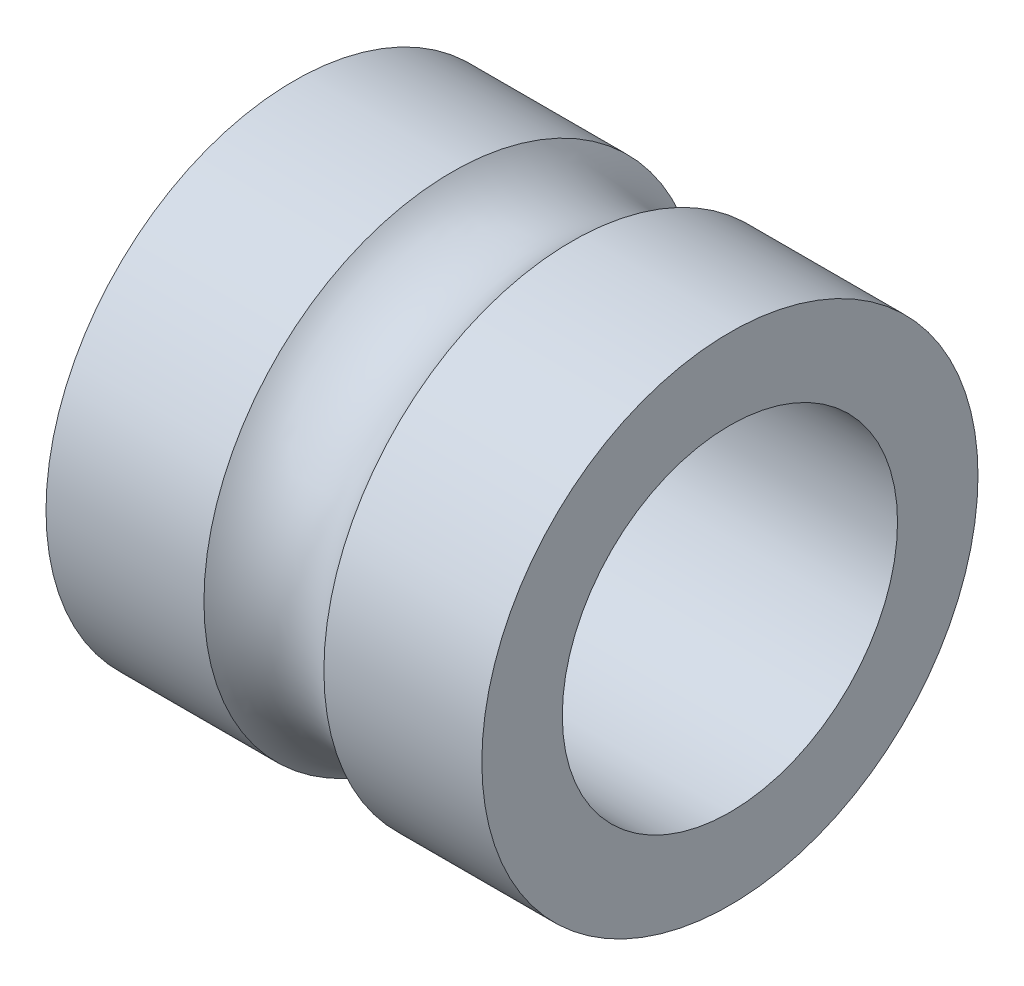
ISO-10303-21;
HEADER;
FILE_DESCRIPTION(('STEP AP214'),'2;1');
FILE_NAME('part.step','',(''),(''),'','','');
FILE_SCHEMA(('AUTOMOTIVE_DESIGN { 1 0 10303 214 1 1 1 1 }'));
ENDSEC;
DATA;
#1=APPLICATION_CONTEXT('core data for automotive mechanical design processes');
#2=APPLICATION_PROTOCOL_DEFINITION('international standard','automotive_design',2000,#1);
#3=PRODUCT_CONTEXT('',#1,'mechanical');
#4=PRODUCT('Part','Part','',(#3));
#5=PRODUCT_RELATED_PRODUCT_CATEGORY('part','',(#4));
#6=PRODUCT_DEFINITION_FORMATION('','',#4);
#7=PRODUCT_DEFINITION_CONTEXT('part definition',#1,'design');
#8=PRODUCT_DEFINITION('design','',#6,#7);
#9=PRODUCT_DEFINITION_SHAPE('','',#8);
#10=(LENGTH_UNIT() NAMED_UNIT(*) SI_UNIT(.MILLI.,.METRE.));
#11=(NAMED_UNIT(*) PLANE_ANGLE_UNIT() SI_UNIT($,.RADIAN.));
#12=(NAMED_UNIT(*) SI_UNIT($,.STERADIAN.) SOLID_ANGLE_UNIT());
#13=UNCERTAINTY_MEASURE_WITH_UNIT(LENGTH_MEASURE(1.E-05),#10,'distance_accuracy_value','');
#14=(GEOMETRIC_REPRESENTATION_CONTEXT(3) GLOBAL_UNCERTAINTY_ASSIGNED_CONTEXT((#13)) GLOBAL_UNIT_ASSIGNED_CONTEXT((#10,
#11,#12)) REPRESENTATION_CONTEXT('',''));
#15=CARTESIAN_POINT('',(0.,0.,0.));
#16=DIRECTION('',(0.,0.,1.));
#17=DIRECTION('',(1.,0.,0.));
#18=AXIS2_PLACEMENT_3D('',#15,#16,#17);
#19=CARTESIAN_POINT('',(10.,11.384615385,0.));
#20=DIRECTION('',(-1.,0.,0.));
#21=DIRECTION('',(0.,0.,1.));
#22=AXIS2_PLACEMENT_3D('',#19,#20,#21);
#23=PLANE('',#22);
#24=CARTESIAN_POINT('',(10.,0.,0.));
#25=DIRECTION('',(-1.,0.,0.));
#26=DIRECTION('',(0.,0.,1.));
#27=AXIS2_PLACEMENT_3D('',#24,#25,#26);
#28=CIRCLE('',#27,11.384615385);
#29=CARTESIAN_POINT('',(10.,0.,11.384615385));
#30=VERTEX_POINT('',#29);
#31=EDGE_CURVE('E10',#30,#30,#28,.T.);
#32=ORIENTED_EDGE('',*,*,#31,.F.);
#33=EDGE_LOOP('',(#32));
#34=FACE_BOUND('',#33,.T.);
#35=CARTESIAN_POINT('',(10.,0.,0.));
#36=DIRECTION('',(-1.,0.,0.));
#37=DIRECTION('',(0.,0.,1.));
#38=AXIS2_PLACEMENT_3D('',#35,#36,#37);
#39=CIRCLE('',#38,7.69230769);
#40=CARTESIAN_POINT('',(10.,0.,7.69230769));
#41=VERTEX_POINT('',#40);
#42=EDGE_CURVE('E61',#41,#41,#39,.T.);
#43=ORIENTED_EDGE('',*,*,#42,.T.);
#44=EDGE_LOOP('',(#43));
#45=FACE_BOUND('',#44,.T.);
#46=ADVANCED_FACE('F39',(#34,#45),#23,.F.);
#47=CARTESIAN_POINT('',(0.,0.,0.));
#48=DIRECTION('',(-1.,0.,0.));
#49=DIRECTION('',(0.,0.,1.));
#50=AXIS2_PLACEMENT_3D('',#47,#48,#49);
#51=CYLINDRICAL_SURFACE('',#50,11.384615385);
#52=CARTESIAN_POINT('',(2.75208366624918,0.,0.));
#53=DIRECTION('',(-1.,0.,0.));
#54=DIRECTION('',(0.,0.,1.));
#55=AXIS2_PLACEMENT_3D('',#52,#53,#54);
#56=CIRCLE('',#55,11.384615385);
#57=CARTESIAN_POINT('',(2.75208366624918,0.,11.384615385));
#58=VERTEX_POINT('',#57);
#59=EDGE_CURVE('E45',#58,#58,#56,.T.);
#60=ORIENTED_EDGE('',*,*,#59,.F.);
#61=EDGE_LOOP('',(#60));
#62=FACE_BOUND('',#61,.T.);
#63=ORIENTED_EDGE('',*,*,#31,.T.);
#64=EDGE_LOOP('',(#63));
#65=FACE_BOUND('',#64,.T.);
#66=ADVANCED_FACE('F86',(#62,#65),#51,.T.);
#67=CARTESIAN_POINT('',(0.,0.,0.));
#68=DIRECTION('',(-1.,0.,0.));
#69=DIRECTION('',(0.,0.,1.));
#70=AXIS2_PLACEMENT_3D('',#67,#68,#69);
#71=TOROIDAL_SURFACE('',#70,13.846153845,3.6923076925);
#72=CARTESIAN_POINT('',(-2.75208366624918,0.,0.));
#73=DIRECTION('',(-1.,0.,0.));
#74=DIRECTION('',(0.,0.,1.));
#75=AXIS2_PLACEMENT_3D('',#72,#73,#74);
#76=CIRCLE('',#75,11.384615385);
#77=CARTESIAN_POINT('',(-2.75208366624918,0.,11.384615385));
#78=VERTEX_POINT('',#77);
#79=EDGE_CURVE('E49',#78,#78,#76,.T.);
#80=ORIENTED_EDGE('',*,*,#79,.F.);
#81=EDGE_LOOP('',(#80));
#82=FACE_BOUND('',#81,.T.);
#83=ORIENTED_EDGE('',*,*,#59,.T.);
#84=EDGE_LOOP('',(#83));
#85=FACE_BOUND('',#84,.T.);
#86=ADVANCED_FACE('F81',(#82,#85),#71,.F.);
#87=CARTESIAN_POINT('',(0.,0.,0.));
#88=DIRECTION('',(-1.,0.,0.));
#89=DIRECTION('',(0.,0.,1.));
#90=AXIS2_PLACEMENT_3D('',#87,#88,#89);
#91=CYLINDRICAL_SURFACE('',#90,11.384615385);
#92=CARTESIAN_POINT('',(-10.,0.,0.));
#93=DIRECTION('',(-1.,0.,0.));
#94=DIRECTION('',(0.,0.,1.));
#95=AXIS2_PLACEMENT_3D('',#92,#93,#94);
#96=CIRCLE('',#95,11.384615385);
#97=CARTESIAN_POINT('',(-10.,0.,11.384615385));
#98=VERTEX_POINT('',#97);
#99=EDGE_CURVE('E53',#98,#98,#96,.T.);
#100=ORIENTED_EDGE('',*,*,#99,.F.);
#101=EDGE_LOOP('',(#100));
#102=FACE_BOUND('',#101,.T.);
#103=ORIENTED_EDGE('',*,*,#79,.T.);
#104=EDGE_LOOP('',(#103));
#105=FACE_BOUND('',#104,.T.);
#106=ADVANCED_FACE('F75',(#102,#105),#91,.T.);
#107=CARTESIAN_POINT('',(-10.,11.384615385,0.));
#108=DIRECTION('',(1.,0.,0.));
#109=DIRECTION('',(0.,0.,-1.));
#110=AXIS2_PLACEMENT_3D('',#107,#108,#109);
#111=PLANE('',#110);
#112=CARTESIAN_POINT('',(-10.,0.,0.));
#113=DIRECTION('',(-1.,0.,0.));
#114=DIRECTION('',(0.,0.,1.));
#115=AXIS2_PLACEMENT_3D('',#112,#113,#114);
#116=CIRCLE('',#115,7.69230769);
#117=CARTESIAN_POINT('',(-10.,0.,7.69230769));
#118=VERTEX_POINT('',#117);
#119=EDGE_CURVE('E58',#118,#118,#116,.T.);
#120=ORIENTED_EDGE('',*,*,#119,.F.);
#121=EDGE_LOOP('',(#120));
#122=FACE_BOUND('',#121,.T.);
#123=ORIENTED_EDGE('',*,*,#99,.T.);
#124=EDGE_LOOP('',(#123));
#125=FACE_BOUND('',#124,.T.);
#126=ADVANCED_FACE('F69',(#122,#125),#111,.F.);
#127=CARTESIAN_POINT('',(0.,0.,0.));
#128=DIRECTION('',(-1.,0.,0.));
#129=DIRECTION('',(0.,0.,1.));
#130=AXIS2_PLACEMENT_3D('',#127,#128,#129);
#131=CYLINDRICAL_SURFACE('',#130,7.69230769);
#132=ORIENTED_EDGE('',*,*,#42,.F.);
#133=EDGE_LOOP('',(#132));
#134=FACE_BOUND('',#133,.T.);
#135=ORIENTED_EDGE('',*,*,#119,.T.);
#136=EDGE_LOOP('',(#135));
#137=FACE_BOUND('',#136,.T.);
#138=ADVANCED_FACE('F66',(#134,#137),#131,.F.);
#139=CLOSED_SHELL('',(#46,#66,#86,#106,#126,#138));
#140=MANIFOLD_SOLID_BREP('B2',#139);
#141=ADVANCED_BREP_SHAPE_REPRESENTATION('',(#18,#140),#14);
#142=SHAPE_DEFINITION_REPRESENTATION(#9,#141);
ENDSEC;
END-ISO-10303-21;
